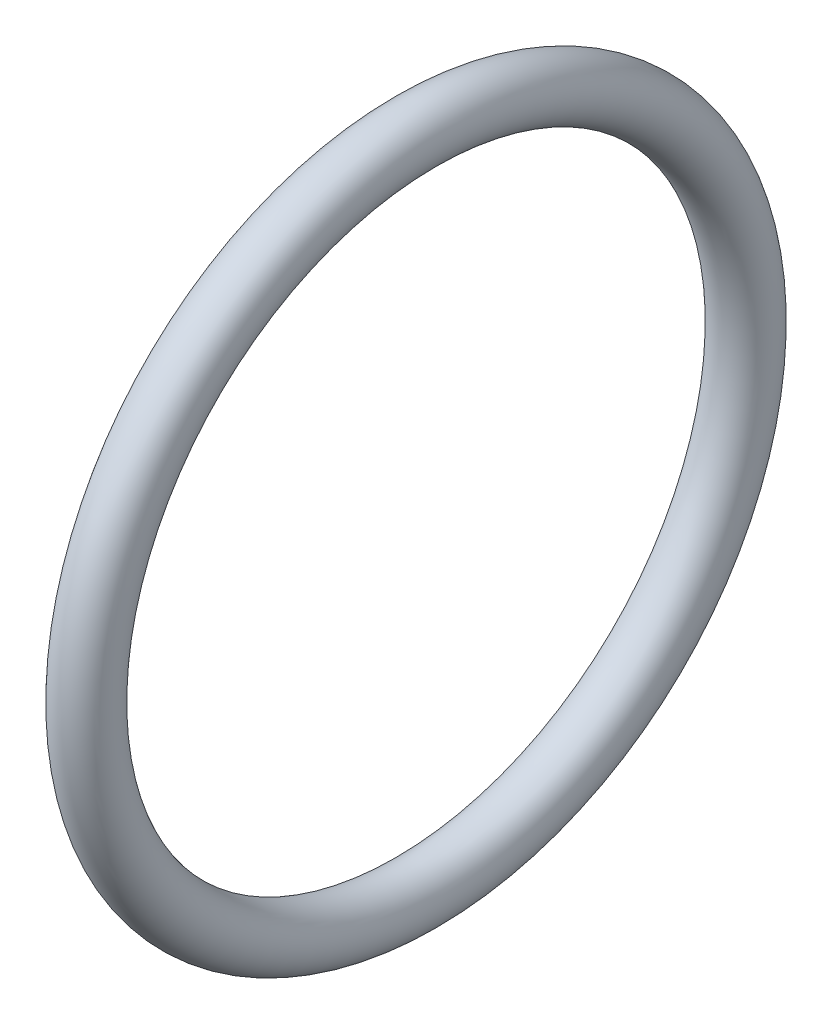
ISO-10303-21;
HEADER;
FILE_DESCRIPTION(('STEP AP214'),'2;1');
FILE_NAME('part.step','',(''),(''),'','','');
FILE_SCHEMA(('AUTOMOTIVE_DESIGN { 1 0 10303 214 1 1 1 1 }'));
ENDSEC;
DATA;
#1=APPLICATION_CONTEXT('core data for automotive mechanical design processes');
#2=APPLICATION_PROTOCOL_DEFINITION('international standard','automotive_design',2000,#1);
#3=PRODUCT_CONTEXT('',#1,'mechanical');
#4=PRODUCT('Part','Part','',(#3));
#5=PRODUCT_RELATED_PRODUCT_CATEGORY('part','',(#4));
#6=PRODUCT_DEFINITION_FORMATION('','',#4);
#7=PRODUCT_DEFINITION_CONTEXT('part definition',#1,'design');
#8=PRODUCT_DEFINITION('design','',#6,#7);
#9=PRODUCT_DEFINITION_SHAPE('','',#8);
#10=(LENGTH_UNIT() NAMED_UNIT(*) SI_UNIT(.MILLI.,.METRE.));
#11=(NAMED_UNIT(*) PLANE_ANGLE_UNIT() SI_UNIT($,.RADIAN.));
#12=(NAMED_UNIT(*) SI_UNIT($,.STERADIAN.) SOLID_ANGLE_UNIT());
#13=UNCERTAINTY_MEASURE_WITH_UNIT(LENGTH_MEASURE(1.E-05),#10,'distance_accuracy_value','');
#14=(GEOMETRIC_REPRESENTATION_CONTEXT(3) GLOBAL_UNCERTAINTY_ASSIGNED_CONTEXT((#13)) GLOBAL_UNIT_ASSIGNED_CONTEXT((#10,
#11,#12)) REPRESENTATION_CONTEXT('',''));
#15=CARTESIAN_POINT('',(0.,0.,0.));
#16=DIRECTION('',(0.,0.,1.));
#17=DIRECTION('',(1.,0.,0.));
#18=AXIS2_PLACEMENT_3D('',#15,#16,#17);
#19=CARTESIAN_POINT('',(3.5,0.,0.));
#20=DIRECTION('',(1.,0.,0.));
#21=DIRECTION('',(0.,-1.,0.));
#22=AXIS2_PLACEMENT_3D('',#19,#20,#21);
#23=TOROIDAL_SURFACE('',#22,28.775,2.5);
#24=CARTESIAN_POINT('',(3.5,-31.275,0.));
#25=VERTEX_POINT('',#24);
#26=VERTEX_LOOP('',#25);
#27=FACE_BOUND('',#26,.T.);
#28=ADVANCED_FACE('F12',(#27),#23,.T.);
#29=CLOSED_SHELL('',(#28));
#30=MANIFOLD_SOLID_BREP('B1',#29);
#31=ADVANCED_BREP_SHAPE_REPRESENTATION('',(#18,#30),#14);
#32=SHAPE_DEFINITION_REPRESENTATION(#9,#31);
ENDSEC;
END-ISO-10303-21;
